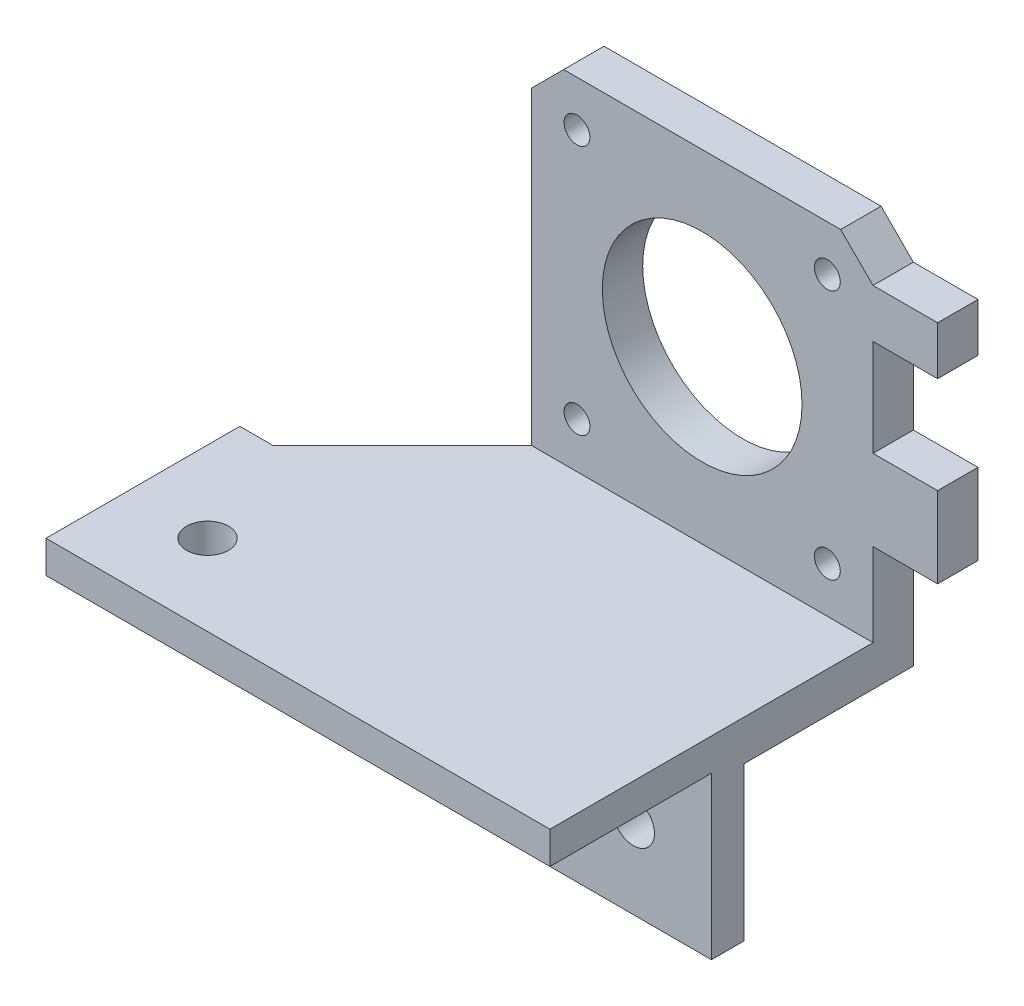
ISO-10303-21;
HEADER;
FILE_DESCRIPTION(('STEP AP214'),'2;1');
FILE_NAME('part.step','',(''),(''),'','','');
FILE_SCHEMA(('AUTOMOTIVE_DESIGN { 1 0 10303 214 1 1 1 1 }'));
ENDSEC;
DATA;
#1=APPLICATION_CONTEXT('core data for automotive mechanical design processes');
#2=APPLICATION_PROTOCOL_DEFINITION('international standard','automotive_design',2000,#1);
#3=PRODUCT_CONTEXT('',#1,'mechanical');
#4=PRODUCT('Part','Part','',(#3));
#5=PRODUCT_RELATED_PRODUCT_CATEGORY('part','',(#4));
#6=PRODUCT_DEFINITION_FORMATION('','',#4);
#7=PRODUCT_DEFINITION_CONTEXT('part definition',#1,'design');
#8=PRODUCT_DEFINITION('design','',#6,#7);
#9=PRODUCT_DEFINITION_SHAPE('','',#8);
#10=(LENGTH_UNIT() NAMED_UNIT(*) SI_UNIT(.MILLI.,.METRE.));
#11=(NAMED_UNIT(*) PLANE_ANGLE_UNIT() SI_UNIT($,.RADIAN.));
#12=(NAMED_UNIT(*) SI_UNIT($,.STERADIAN.) SOLID_ANGLE_UNIT());
#13=UNCERTAINTY_MEASURE_WITH_UNIT(LENGTH_MEASURE(1.E-05),#10,'distance_accuracy_value','');
#14=(GEOMETRIC_REPRESENTATION_CONTEXT(3) GLOBAL_UNCERTAINTY_ASSIGNED_CONTEXT((#13)) GLOBAL_UNIT_ASSIGNED_CONTEXT((#10,
#11,#12)) REPRESENTATION_CONTEXT('',''));
#15=CARTESIAN_POINT('',(0.,0.,0.));
#16=DIRECTION('',(0.,0.,1.));
#17=DIRECTION('',(1.,0.,0.));
#18=AXIS2_PLACEMENT_3D('',#15,#16,#17);
#19=CARTESIAN_POINT('',(-40.,-12.9710597708542,-44.));
#20=DIRECTION('',(-1.,0.,0.));
#21=DIRECTION('',(0.,0.,-1.));
#22=AXIS2_PLACEMENT_3D('',#19,#20,#21);
#23=PLANE('',#22);
#24=DIRECTION('',(0.,0.,1.));
#25=VECTOR('',#24,1.);
#26=CARTESIAN_POINT('',(-40.,31.3289402291458,-65.));
#27=LINE('',#26,#25);
#28=CARTESIAN_POINT('',(-40.,31.3289402291458,-65.));
#29=VERTEX_POINT('',#28);
#30=CARTESIAN_POINT('',(-40.,31.3289402291458,-60.));
#31=VERTEX_POINT('',#30);
#32=EDGE_CURVE('E424',#29,#31,#27,.T.);
#33=ORIENTED_EDGE('',*,*,#32,.F.);
#34=DIRECTION('',(0.,1.,0.));
#35=VECTOR('',#34,1.);
#36=CARTESIAN_POINT('',(-40.,6.02894022914576,-65.));
#37=LINE('',#36,#35);
#38=CARTESIAN_POINT('',(-40.,43.3289402291458,-65.));
#39=VERTEX_POINT('',#38);
#40=EDGE_CURVE('E198',#29,#39,#37,.T.);
#41=ORIENTED_EDGE('',*,*,#40,.T.);
#42=DIRECTION('',(0.,0.,-1.));
#43=VECTOR('',#42,1.);
#44=CARTESIAN_POINT('',(-40.,43.3289402291458,-65.));
#45=LINE('',#44,#43);
#46=CARTESIAN_POINT('',(-40.0000000000001,43.3289402291458,-60.));
#47=VERTEX_POINT('',#46);
#48=EDGE_CURVE('E199',#47,#39,#45,.T.);
#49=ORIENTED_EDGE('',*,*,#48,.F.);
#50=DIRECTION('',(0.,1.,0.));
#51=VECTOR('',#50,1.);
#52=CARTESIAN_POINT('',(-40.,6.02894022914576,-60.));
#53=LINE('',#52,#51);
#54=EDGE_CURVE('E47',#31,#47,#53,.T.);
#55=ORIENTED_EDGE('',*,*,#54,.F.);
#56=EDGE_LOOP('',(#33,#41,#49,#55));
#57=FACE_BOUND('',#56,.T.);
#58=ADVANCED_FACE('F32',(#57),#23,.F.);
#59=DIRECTION('',(0.,0.,-1.));
#60=VECTOR('',#59,1.);
#61=CARTESIAN_POINT('',(-40.,21.3289402291457,-65.));
#62=LINE('',#61,#60);
#63=CARTESIAN_POINT('',(-40.,21.3289402291457,-60.));
#64=VERTEX_POINT('',#63);
#65=CARTESIAN_POINT('',(-40.,21.3289402291457,-65.));
#66=VERTEX_POINT('',#65);
#67=EDGE_CURVE('E55',#64,#66,#62,.T.);
#68=ORIENTED_EDGE('',*,*,#67,.F.);
#69=CARTESIAN_POINT('',(-40.,11.0289402291458,-60.));
#70=VERTEX_POINT('',#69);
#71=EDGE_CURVE('E315',#70,#64,#53,.T.);
#72=ORIENTED_EDGE('',*,*,#71,.F.);
#73=DIRECTION('',(0.,0.,1.));
#74=VECTOR('',#73,1.);
#75=CARTESIAN_POINT('',(-40.,11.0289402291458,-44.));
#76=LINE('',#75,#74);
#77=CARTESIAN_POINT('',(-40.,11.0289402291458,-20.));
#78=VERTEX_POINT('',#77);
#79=EDGE_CURVE('E375',#70,#78,#76,.T.);
#80=ORIENTED_EDGE('',*,*,#79,.T.);
#81=DIRECTION('',(0.,1.,0.));
#82=VECTOR('',#81,1.);
#83=CARTESIAN_POINT('',(-40.,11.0289402291458,-20.));
#84=LINE('',#83,#82);
#85=CARTESIAN_POINT('',(-40.,7.02894022914576,-20.));
#86=VERTEX_POINT('',#85);
#87=EDGE_CURVE('E240',#86,#78,#84,.T.);
#88=ORIENTED_EDGE('',*,*,#87,.F.);
#89=DIRECTION('',(0.,0.,-1.));
#90=VECTOR('',#89,1.);
#91=CARTESIAN_POINT('',(-40.,7.02894022914579,42.5196876527665));
#92=LINE('',#91,#90);
#93=CARTESIAN_POINT('',(-40.,7.02894022914575,-40.));
#94=VERTEX_POINT('',#93);
#95=EDGE_CURVE('E248',#86,#94,#92,.T.);
#96=ORIENTED_EDGE('',*,*,#95,.T.);
#97=DIRECTION('',(0.,1.,0.));
#98=VECTOR('',#97,1.);
#99=CARTESIAN_POINT('',(-40.,-12.9710597708542,-40.));
#100=LINE('',#99,#98);
#101=CARTESIAN_POINT('',(-40.,-12.9710597708542,-40.));
#102=VERTEX_POINT('',#101);
#103=EDGE_CURVE('E344',#102,#94,#100,.T.);
#104=ORIENTED_EDGE('',*,*,#103,.F.);
#105=DIRECTION('',(0.,0.,1.));
#106=VECTOR('',#105,1.);
#107=CARTESIAN_POINT('',(-40.,-12.9710597708542,-44.));
#108=LINE('',#107,#106);
#109=CARTESIAN_POINT('',(-40.,-12.9710597708542,-44.));
#110=VERTEX_POINT('',#109);
#111=EDGE_CURVE('E361',#110,#102,#108,.T.);
#112=ORIENTED_EDGE('',*,*,#111,.F.);
#113=DIRECTION('',(0.,1.,0.));
#114=VECTOR('',#113,1.);
#115=CARTESIAN_POINT('',(-40.,-12.9710597708542,-44.));
#116=LINE('',#115,#114);
#117=CARTESIAN_POINT('',(-40.,6.02894022914576,-44.));
#118=VERTEX_POINT('',#117);
#119=EDGE_CURVE('E349',#110,#118,#116,.T.);
#120=ORIENTED_EDGE('',*,*,#119,.T.);
#121=DIRECTION('',(0.,0.,1.));
#122=VECTOR('',#121,1.);
#123=CARTESIAN_POINT('',(-40.,6.02894022914575,-102.594483210857));
#124=LINE('',#123,#122);
#125=CARTESIAN_POINT('',(-40.,6.02894022914576,-65.));
#126=VERTEX_POINT('',#125);
#127=EDGE_CURVE('E337',#126,#118,#124,.T.);
#128=ORIENTED_EDGE('',*,*,#127,.F.);
#129=EDGE_CURVE('E299',#126,#66,#37,.T.);
#130=ORIENTED_EDGE('',*,*,#129,.T.);
#131=EDGE_LOOP('',(#68,#72,#80,#88,#96,#104,#112,#120,#128,#130));
#132=FACE_BOUND('',#131,.T.);
#133=ADVANCED_FACE('F395',(#132),#23,.F.);
#134=CARTESIAN_POINT('',(0.,0.,-40.));
#135=DIRECTION('',(0.,0.,-1.));
#136=DIRECTION('',(1.,0.,0.));
#137=AXIS2_PLACEMENT_3D('',#134,#135,#136);
#138=PLANE('',#137);
#139=CARTESIAN_POINT('',(-49.6556066891385,-2.97105977085422,-40.));
#140=DIRECTION('',(0.,0.,1.));
#141=DIRECTION('',(1.,0.,0.));
#142=AXIS2_PLACEMENT_3D('',#139,#140,#141);
#143=CIRCLE('',#142,2.6);
#144=CARTESIAN_POINT('',(-47.0556066891385,-2.97105977085422,-40.));
#145=VERTEX_POINT('',#144);
#146=EDGE_CURVE('E265',#145,#145,#143,.T.);
#147=ORIENTED_EDGE('',*,*,#146,.F.);
#148=EDGE_LOOP('',(#147));
#149=FACE_BOUND('',#148,.T.);
#150=CARTESIAN_POINT('',(-69.6556066891385,-2.97105977085422,-40.));
#151=DIRECTION('',(0.,0.,1.));
#152=DIRECTION('',(1.,0.,0.));
#153=AXIS2_PLACEMENT_3D('',#150,#151,#152);
#154=CIRCLE('',#153,2.6);
#155=CARTESIAN_POINT('',(-67.0556066891385,-2.97105977085422,-40.));
#156=VERTEX_POINT('',#155);
#157=EDGE_CURVE('E259',#156,#156,#154,.T.);
#158=ORIENTED_EDGE('',*,*,#157,.F.);
#159=EDGE_LOOP('',(#158));
#160=FACE_BOUND('',#159,.T.);
#161=CARTESIAN_POINT('',(-89.6556066891385,-2.97105977085422,-40.));
#162=DIRECTION('',(0.,0.,1.));
#163=DIRECTION('',(1.,0.,0.));
#164=AXIS2_PLACEMENT_3D('',#161,#162,#163);
#165=CIRCLE('',#164,2.6);
#166=CARTESIAN_POINT('',(-87.0556066891385,-2.97105977085422,-40.));
#167=VERTEX_POINT('',#166);
#168=EDGE_CURVE('E252',#167,#167,#165,.T.);
#169=ORIENTED_EDGE('',*,*,#168,.F.);
#170=EDGE_LOOP('',(#169));
#171=FACE_BOUND('',#170,.T.);
#172=DIRECTION('',(-1.,0.,0.));
#173=VECTOR('',#172,1.);
#174=CARTESIAN_POINT('',(-40.,7.02894022914576,-40.));
#175=LINE('',#174,#173);
#176=CARTESIAN_POINT('',(-102.391596743468,7.02894022914576,-40.));
#177=VERTEX_POINT('',#176);
#178=EDGE_CURVE('E231',#94,#177,#175,.T.);
#179=ORIENTED_EDGE('',*,*,#178,.T.);
#180=DIRECTION('',(0.,-1.,0.));
#181=VECTOR('',#180,1.);
#182=CARTESIAN_POINT('',(-102.391596743468,-12.9710597708542,-40.));
#183=LINE('',#182,#181);
#184=CARTESIAN_POINT('',(-102.391596743468,-12.9710597708542,-40.));
#185=VERTEX_POINT('',#184);
#186=EDGE_CURVE('E364',#177,#185,#183,.T.);
#187=ORIENTED_EDGE('',*,*,#186,.T.);
#188=DIRECTION('',(1.,0.,0.));
#189=VECTOR('',#188,1.);
#190=CARTESIAN_POINT('',(-40.,-12.9710597708542,-40.));
#191=LINE('',#190,#189);
#192=EDGE_CURVE('E353',#185,#102,#191,.T.);
#193=ORIENTED_EDGE('',*,*,#192,.T.);
#194=ORIENTED_EDGE('',*,*,#103,.T.);
#195=EDGE_LOOP('',(#179,#187,#193,#194));
#196=FACE_BOUND('',#195,.T.);
#197=ADVANCED_FACE('F467',(#149,#160,#171,#196),#138,.F.);
#198=CARTESIAN_POINT('',(-40.,11.0289402291458,-44.));
#199=DIRECTION('',(0.,-1.,0.));
#200=DIRECTION('',(0.,0.,1.));
#201=AXIS2_PLACEMENT_3D('',#198,#199,#200);
#202=PLANE('',#201);
#203=CARTESIAN_POINT('',(-92.3915967434677,11.0289402291458,-30.));
#204=DIRECTION('',(0.,-1.,0.));
#205=DIRECTION('',(0.,0.,-1.));
#206=AXIS2_PLACEMENT_3D('',#203,#204,#205);
#207=CIRCLE('',#206,2.6);
#208=CARTESIAN_POINT('',(-92.3915967434677,11.0289402291458,-32.6));
#209=VERTEX_POINT('',#208);
#210=EDGE_CURVE('E227',#209,#209,#207,.T.);
#211=ORIENTED_EDGE('',*,*,#210,.T.);
#212=EDGE_LOOP('',(#211));
#213=FACE_BOUND('',#212,.T.);
#214=ORIENTED_EDGE('',*,*,#79,.F.);
#215=DIRECTION('',(-1.,0.,0.));
#216=VECTOR('',#215,1.);
#217=CARTESIAN_POINT('',(-40.,11.0289402291458,-60.));
#218=LINE('',#217,#216);
#219=CARTESIAN_POINT('',(-82.3,11.0289402291458,-60.));
#220=VERTEX_POINT('',#219);
#221=EDGE_CURVE('E340',#70,#220,#218,.T.);
#222=ORIENTED_EDGE('',*,*,#221,.T.);
#223=DIRECTION('',(0.707106781186544,0.,-0.707106781186551));
#224=VECTOR('',#223,1.);
#225=CARTESIAN_POINT('',(-69.1500000000003,11.0289402291458,-73.15));
#226=LINE('',#225,#224);
#227=CARTESIAN_POINT('',(-98.3,11.0289402291458,-44.));
#228=VERTEX_POINT('',#227);
#229=EDGE_CURVE('E11',#228,#220,#226,.T.);
#230=ORIENTED_EDGE('',*,*,#229,.F.);
#231=DIRECTION('',(-1.,0.,0.));
#232=VECTOR('',#231,1.);
#233=CARTESIAN_POINT('',(-40.,11.0289402291458,-44.));
#234=LINE('',#233,#232);
#235=CARTESIAN_POINT('',(-102.391596743468,11.0289402291458,-44.));
#236=VERTEX_POINT('',#235);
#237=EDGE_CURVE('E352',#228,#236,#234,.T.);
#238=ORIENTED_EDGE('',*,*,#237,.T.);
#239=DIRECTION('',(0.,0.,1.));
#240=VECTOR('',#239,1.);
#241=CARTESIAN_POINT('',(-102.391596743468,11.0289402291458,-44.));
#242=LINE('',#241,#240);
#243=CARTESIAN_POINT('',(-102.391596743468,11.0289402291458,-20.));
#244=VERTEX_POINT('',#243);
#245=EDGE_CURVE('E372',#236,#244,#242,.T.);
#246=ORIENTED_EDGE('',*,*,#245,.T.);
#247=DIRECTION('',(-1.,0.,0.));
#248=VECTOR('',#247,1.);
#249=CARTESIAN_POINT('',(-40.,11.0289402291458,-20.));
#250=LINE('',#249,#248);
#251=EDGE_CURVE('E238',#78,#244,#250,.T.);
#252=ORIENTED_EDGE('',*,*,#251,.F.);
#253=EDGE_LOOP('',(#214,#222,#230,#238,#246,#252));
#254=FACE_BOUND('',#253,.T.);
#255=ADVANCED_FACE('F408',(#213,#254),#202,.F.);
#256=CARTESIAN_POINT('',(-102.391596743468,-12.9710597708542,-44.));
#257=DIRECTION('',(1.,0.,0.));
#258=DIRECTION('',(0.,0.,1.));
#259=AXIS2_PLACEMENT_3D('',#256,#257,#258);
#260=PLANE('',#259);
#261=ORIENTED_EDGE('',*,*,#245,.F.);
#262=DIRECTION('',(0.,-1.,0.));
#263=VECTOR('',#262,1.);
#264=CARTESIAN_POINT('',(-102.391596743468,-12.9710597708542,-44.));
#265=LINE('',#264,#263);
#266=CARTESIAN_POINT('',(-102.391596743468,-12.9710597708542,-44.));
#267=VERTEX_POINT('',#266);
#268=EDGE_CURVE('E356',#236,#267,#265,.T.);
#269=ORIENTED_EDGE('',*,*,#268,.T.);
#270=DIRECTION('',(0.,0.,1.));
#271=VECTOR('',#270,1.);
#272=CARTESIAN_POINT('',(-102.391596743468,-12.9710597708542,-44.));
#273=LINE('',#272,#271);
#274=EDGE_CURVE('E370',#267,#185,#273,.T.);
#275=ORIENTED_EDGE('',*,*,#274,.T.);
#276=ORIENTED_EDGE('',*,*,#186,.F.);
#277=DIRECTION('',(0.,0.,-1.));
#278=VECTOR('',#277,1.);
#279=CARTESIAN_POINT('',(-102.391596743468,7.02894022914579,42.5196876527665));
#280=LINE('',#279,#278);
#281=CARTESIAN_POINT('',(-102.391596743468,7.02894022914576,-20.));
#282=VERTEX_POINT('',#281);
#283=EDGE_CURVE('E246',#282,#177,#280,.T.);
#284=ORIENTED_EDGE('',*,*,#283,.F.);
#285=DIRECTION('',(0.,-1.,0.));
#286=VECTOR('',#285,1.);
#287=CARTESIAN_POINT('',(-102.391596743468,11.0289402291458,-20.));
#288=LINE('',#287,#286);
#289=EDGE_CURVE('E234',#244,#282,#288,.T.);
#290=ORIENTED_EDGE('',*,*,#289,.F.);
#291=EDGE_LOOP('',(#261,#269,#275,#276,#284,#290));
#292=FACE_BOUND('',#291,.T.);
#293=ADVANCED_FACE('F404',(#292),#260,.F.);
#294=CARTESIAN_POINT('',(-40.,-12.9710597708542,-44.));
#295=DIRECTION('',(0.,1.,0.));
#296=DIRECTION('',(0.,0.,-1.));
#297=AXIS2_PLACEMENT_3D('',#294,#295,#296);
#298=PLANE('',#297);
#299=ORIENTED_EDGE('',*,*,#192,.F.);
#300=ORIENTED_EDGE('',*,*,#274,.F.);
#301=DIRECTION('',(1.,0.,0.));
#302=VECTOR('',#301,1.);
#303=CARTESIAN_POINT('',(-40.,-12.9710597708542,-44.));
#304=LINE('',#303,#302);
#305=EDGE_CURVE('E359',#267,#110,#304,.T.);
#306=ORIENTED_EDGE('',*,*,#305,.T.);
#307=ORIENTED_EDGE('',*,*,#111,.T.);
#308=EDGE_LOOP('',(#299,#300,#306,#307));
#309=FACE_BOUND('',#308,.T.);
#310=ADVANCED_FACE('F401',(#309),#298,.F.);
#311=CARTESIAN_POINT('',(0.,0.,-44.));
#312=DIRECTION('',(0.,0.,-1.));
#313=DIRECTION('',(1.,0.,0.));
#314=AXIS2_PLACEMENT_3D('',#311,#312,#313);
#315=PLANE('',#314);
#316=CARTESIAN_POINT('',(-89.6556066891385,-2.97105977085422,-44.));
#317=DIRECTION('',(0.,0.,1.));
#318=DIRECTION('',(1.,0.,0.));
#319=AXIS2_PLACEMENT_3D('',#316,#317,#318);
#320=CIRCLE('',#319,2.6);
#321=CARTESIAN_POINT('',(-87.0556066891385,-2.97105977085422,-44.));
#322=VERTEX_POINT('',#321);
#323=EDGE_CURVE('E256',#322,#322,#320,.T.);
#324=ORIENTED_EDGE('',*,*,#323,.T.);
#325=EDGE_LOOP('',(#324));
#326=FACE_BOUND('',#325,.T.);
#327=CARTESIAN_POINT('',(-69.6556066891385,-2.97105977085422,-44.));
#328=DIRECTION('',(0.,0.,1.));
#329=DIRECTION('',(1.,0.,0.));
#330=AXIS2_PLACEMENT_3D('',#327,#328,#329);
#331=CIRCLE('',#330,2.6);
#332=CARTESIAN_POINT('',(-67.0556066891385,-2.97105977085422,-44.));
#333=VERTEX_POINT('',#332);
#334=EDGE_CURVE('E262',#333,#333,#331,.T.);
#335=ORIENTED_EDGE('',*,*,#334,.T.);
#336=EDGE_LOOP('',(#335));
#337=FACE_BOUND('',#336,.T.);
#338=CARTESIAN_POINT('',(-49.6556066891385,-2.97105977085422,-44.));
#339=DIRECTION('',(0.,0.,1.));
#340=DIRECTION('',(1.,0.,0.));
#341=AXIS2_PLACEMENT_3D('',#338,#339,#340);
#342=CIRCLE('',#341,2.6);
#343=CARTESIAN_POINT('',(-47.0556066891385,-2.97105977085422,-44.));
#344=VERTEX_POINT('',#343);
#345=EDGE_CURVE('E243',#344,#344,#342,.T.);
#346=ORIENTED_EDGE('',*,*,#345,.T.);
#347=EDGE_LOOP('',(#346));
#348=FACE_BOUND('',#347,.T.);
#349=DIRECTION('',(1.,0.,0.));
#350=VECTOR('',#349,1.);
#351=CARTESIAN_POINT('',(-40.,6.02894022914577,-44.));
#352=LINE('',#351,#350);
#353=CARTESIAN_POINT('',(-98.3,6.02894022914576,-44.));
#354=VERTEX_POINT('',#353);
#355=EDGE_CURVE('E338',#354,#118,#352,.T.);
#356=ORIENTED_EDGE('',*,*,#355,.T.);
#357=ORIENTED_EDGE('',*,*,#119,.F.);
#358=ORIENTED_EDGE('',*,*,#305,.F.);
#359=ORIENTED_EDGE('',*,*,#268,.F.);
#360=ORIENTED_EDGE('',*,*,#237,.F.);
#361=DIRECTION('',(0.,1.,0.));
#362=VECTOR('',#361,1.);
#363=CARTESIAN_POINT('',(-98.3,0.,-44.));
#364=LINE('',#363,#362);
#365=EDGE_CURVE('E381',#354,#228,#364,.T.);
#366=ORIENTED_EDGE('',*,*,#365,.F.);
#367=EDGE_LOOP('',(#356,#357,#358,#359,#360,#366));
#368=FACE_BOUND('',#367,.T.);
#369=ADVANCED_FACE('F389',(#326,#337,#348,#368),#315,.T.);
#370=CARTESIAN_POINT('',(-82.3,11.0289402291457,-102.594483210857));
#371=DIRECTION('',(1.,0.,0.));
#372=DIRECTION('',(0.,0.,1.));
#373=AXIS2_PLACEMENT_3D('',#370,#371,#372);
#374=PLANE('',#373);
#375=DIRECTION('',(0.,-1.,0.));
#376=VECTOR('',#375,1.);
#377=CARTESIAN_POINT('',(-82.3,6.02894022914576,-60.));
#378=LINE('',#377,#376);
#379=CARTESIAN_POINT('',(-82.3,49.3289402291458,-60.));
#380=VERTEX_POINT('',#379);
#381=EDGE_CURVE('E325',#380,#220,#378,.T.);
#382=ORIENTED_EDGE('',*,*,#381,.F.);
#383=DIRECTION('',(0.,0.,1.));
#384=VECTOR('',#383,1.);
#385=CARTESIAN_POINT('',(-82.3,49.3289402291458,-65.));
#386=LINE('',#385,#384);
#387=CARTESIAN_POINT('',(-82.3,49.3289402291458,-65.));
#388=VERTEX_POINT('',#387);
#389=EDGE_CURVE('E314',#388,#380,#386,.T.);
#390=ORIENTED_EDGE('',*,*,#389,.F.);
#391=DIRECTION('',(0.,-1.,0.));
#392=VECTOR('',#391,1.);
#393=CARTESIAN_POINT('',(-82.3,6.02894022914575,-65.));
#394=LINE('',#393,#392);
#395=CARTESIAN_POINT('',(-82.3,6.02894022914575,-65.));
#396=VERTEX_POINT('',#395);
#397=EDGE_CURVE('E309',#388,#396,#394,.T.);
#398=ORIENTED_EDGE('',*,*,#397,.T.);
#399=DIRECTION('',(0.,0.,1.));
#400=VECTOR('',#399,1.);
#401=CARTESIAN_POINT('',(-82.3,6.02894022914574,-102.594483210857));
#402=LINE('',#401,#400);
#403=CARTESIAN_POINT('',(-82.3,6.02894022914576,-60.0000000000001));
#404=VERTEX_POINT('',#403);
#405=EDGE_CURVE('E341',#396,#404,#402,.T.);
#406=ORIENTED_EDGE('',*,*,#405,.T.);
#407=DIRECTION('',(0.,-1.,0.));
#408=VECTOR('',#407,1.);
#409=CARTESIAN_POINT('',(-82.3,11.0289402291458,-60.0000000000001));
#410=LINE('',#409,#408);
#411=EDGE_CURVE('E378',#220,#404,#410,.T.);
#412=ORIENTED_EDGE('',*,*,#411,.F.);
#413=EDGE_LOOP('',(#382,#390,#398,#406,#412));
#414=FACE_BOUND('',#413,.T.);
#415=ADVANCED_FACE('F417',(#414),#374,.F.);
#416=CARTESIAN_POINT('',(-40.,6.02894022914575,-102.594483210857));
#417=DIRECTION('',(0.,1.,0.));
#418=DIRECTION('',(-1.,0.,0.));
#419=AXIS2_PLACEMENT_3D('',#416,#417,#418);
#420=PLANE('',#419);
#421=ORIENTED_EDGE('',*,*,#127,.T.);
#422=ORIENTED_EDGE('',*,*,#355,.F.);
#423=DIRECTION('',(-0.707106781186544,0.,0.707106781186551));
#424=VECTOR('',#423,1.);
#425=CARTESIAN_POINT('',(-39.8527583945717,6.02894022914575,-102.447241605429));
#426=LINE('',#425,#424);
#427=EDGE_CURVE('E40',#404,#354,#426,.T.);
#428=ORIENTED_EDGE('',*,*,#427,.F.);
#429=ORIENTED_EDGE('',*,*,#405,.F.);
#430=DIRECTION('',(1.,0.,0.));
#431=VECTOR('',#430,1.);
#432=CARTESIAN_POINT('',(-40.,6.02894022914576,-65.));
#433=LINE('',#432,#431);
#434=EDGE_CURVE('E312',#396,#126,#433,.T.);
#435=ORIENTED_EDGE('',*,*,#434,.T.);
#436=EDGE_LOOP('',(#421,#422,#428,#429,#435));
#437=FACE_BOUND('',#436,.T.);
#438=ADVANCED_FACE('F392',(#437),#420,.F.);
#439=CARTESIAN_POINT('',(0.,0.,-60.));
#440=DIRECTION('',(0.,0.,-1.));
#441=DIRECTION('',(1.,0.,0.));
#442=AXIS2_PLACEMENT_3D('',#439,#440,#441);
#443=PLANE('',#442);
#444=CARTESIAN_POINT('',(-45.65,47.6789402291458,-60.));
#445=DIRECTION('',(0.,0.,1.));
#446=DIRECTION('',(1.,0.,0.));
#447=AXIS2_PLACEMENT_3D('',#444,#445,#446);
#448=CIRCLE('',#447,1.6);
#449=CARTESIAN_POINT('',(-44.05,47.6789402291458,-60.));
#450=VERTEX_POINT('',#449);
#451=EDGE_CURVE('E291',#450,#450,#448,.T.);
#452=ORIENTED_EDGE('',*,*,#451,.F.);
#453=EDGE_LOOP('',(#452));
#454=FACE_BOUND('',#453,.T.);
#455=CARTESIAN_POINT('',(-61.15,32.1789402291458,-60.));
#456=DIRECTION('',(0.,0.,1.));
#457=DIRECTION('',(1.,0.,0.));
#458=AXIS2_PLACEMENT_3D('',#455,#456,#457);
#459=CIRCLE('',#458,12.3643409800213);
#460=CARTESIAN_POINT('',(-48.7856590199787,32.1789402291458,-60.));
#461=VERTEX_POINT('',#460);
#462=EDGE_CURVE('E285',#461,#461,#459,.T.);
#463=ORIENTED_EDGE('',*,*,#462,.F.);
#464=EDGE_LOOP('',(#463));
#465=FACE_BOUND('',#464,.T.);
#466=CARTESIAN_POINT('',(-76.65,47.6789402291455,-60.));
#467=DIRECTION('',(0.,0.,1.));
#468=DIRECTION('',(1.,0.,0.));
#469=AXIS2_PLACEMENT_3D('',#466,#467,#468);
#470=CIRCLE('',#469,1.6);
#471=CARTESIAN_POINT('',(-75.05,47.6789402291455,-60.));
#472=VERTEX_POINT('',#471);
#473=EDGE_CURVE('E279',#472,#472,#470,.T.);
#474=ORIENTED_EDGE('',*,*,#473,.F.);
#475=EDGE_LOOP('',(#474));
#476=FACE_BOUND('',#475,.T.);
#477=CARTESIAN_POINT('',(-76.6499999999997,16.6789402291455,-60.));
#478=DIRECTION('',(0.,0.,1.));
#479=DIRECTION('',(1.,0.,0.));
#480=AXIS2_PLACEMENT_3D('',#477,#478,#479);
#481=CIRCLE('',#480,1.6);
#482=CARTESIAN_POINT('',(-75.0499999999997,16.6789402291455,-60.));
#483=VERTEX_POINT('',#482);
#484=EDGE_CURVE('E273',#483,#483,#481,.T.);
#485=ORIENTED_EDGE('',*,*,#484,.F.);
#486=EDGE_LOOP('',(#485));
#487=FACE_BOUND('',#486,.T.);
#488=CARTESIAN_POINT('',(-45.6499999999997,16.6789402291458,-60.));
#489=DIRECTION('',(0.,0.,1.));
#490=DIRECTION('',(1.,0.,0.));
#491=AXIS2_PLACEMENT_3D('',#488,#489,#490);
#492=CIRCLE('',#491,1.6);
#493=CARTESIAN_POINT('',(-44.0499999999997,16.6789402291458,-60.));
#494=VERTEX_POINT('',#493);
#495=EDGE_CURVE('E255',#494,#494,#492,.T.);
#496=ORIENTED_EDGE('',*,*,#495,.F.);
#497=EDGE_LOOP('',(#496));
#498=FACE_BOUND('',#497,.T.);
#499=ORIENTED_EDGE('',*,*,#71,.T.);
#500=DIRECTION('',(-1.,0.,0.));
#501=VECTOR('',#500,1.);
#502=CARTESIAN_POINT('',(-32.,21.3289402291457,-60.));
#503=LINE('',#502,#501);
#504=CARTESIAN_POINT('',(-32.,21.3289402291457,-60.));
#505=VERTEX_POINT('',#504);
#506=EDGE_CURVE('E204',#505,#64,#503,.T.);
#507=ORIENTED_EDGE('',*,*,#506,.F.);
#508=DIRECTION('',(0.,-1.,0.));
#509=VECTOR('',#508,1.);
#510=CARTESIAN_POINT('',(-32.,21.3289402291457,-60.));
#511=LINE('',#510,#509);
#512=CARTESIAN_POINT('',(-32.,31.3289402291458,-60.));
#513=VERTEX_POINT('',#512);
#514=EDGE_CURVE('E183',#513,#505,#511,.T.);
#515=ORIENTED_EDGE('',*,*,#514,.F.);
#516=DIRECTION('',(-1.,0.,0.));
#517=VECTOR('',#516,1.);
#518=CARTESIAN_POINT('',(-32.,31.3289402291458,-60.));
#519=LINE('',#518,#517);
#520=EDGE_CURVE('E180',#513,#31,#519,.T.);
#521=ORIENTED_EDGE('',*,*,#520,.T.);
#522=ORIENTED_EDGE('',*,*,#54,.T.);
#523=DIRECTION('',(-1.,0.,0.));
#524=VECTOR('',#523,1.);
#525=CARTESIAN_POINT('',(-32.,43.3289402291458,-60.));
#526=LINE('',#525,#524);
#527=CARTESIAN_POINT('',(-32.,43.3289402291458,-60.));
#528=VERTEX_POINT('',#527);
#529=EDGE_CURVE('E218',#528,#47,#526,.T.);
#530=ORIENTED_EDGE('',*,*,#529,.F.);
#531=DIRECTION('',(0.,-1.,0.));
#532=VECTOR('',#531,1.);
#533=CARTESIAN_POINT('',(-32.,49.3289402291458,-60.));
#534=LINE('',#533,#532);
#535=CARTESIAN_POINT('',(-32.,49.3289402291458,-60.));
#536=VERTEX_POINT('',#535);
#537=EDGE_CURVE('E212',#536,#528,#534,.T.);
#538=ORIENTED_EDGE('',*,*,#537,.F.);
#539=DIRECTION('',(-1.,0.,0.));
#540=VECTOR('',#539,1.);
#541=CARTESIAN_POINT('',(-32.,49.3289402291458,-60.));
#542=LINE('',#541,#540);
#543=CARTESIAN_POINT('',(-40.0000000000001,49.3289402291458,-60.));
#544=VERTEX_POINT('',#543);
#545=EDGE_CURVE('E221',#536,#544,#542,.T.);
#546=ORIENTED_EDGE('',*,*,#545,.T.);
#547=DIRECTION('',(-0.707106781186548,0.707106781186547,0.));
#548=VECTOR('',#547,1.);
#549=CARTESIAN_POINT('',(-40.0000000000001,49.3289402291458,-60.));
#550=LINE('',#549,#548);
#551=CARTESIAN_POINT('',(-44.,53.3289402291458,-60.));
#552=VERTEX_POINT('',#551);
#553=EDGE_CURVE('E317',#544,#552,#550,.T.);
#554=ORIENTED_EDGE('',*,*,#553,.T.);
#555=DIRECTION('',(-1.,0.,0.));
#556=VECTOR('',#555,1.);
#557=CARTESIAN_POINT('',(-44.,53.3289402291458,-60.));
#558=LINE('',#557,#556);
#559=CARTESIAN_POINT('',(-78.3000000000001,53.3289402291457,-60.));
#560=VERTEX_POINT('',#559);
#561=EDGE_CURVE('E320',#552,#560,#558,.T.);
#562=ORIENTED_EDGE('',*,*,#561,.T.);
#563=DIRECTION('',(-0.707106781186547,-0.707106781186547,0.));
#564=VECTOR('',#563,1.);
#565=CARTESIAN_POINT('',(-78.3000000000001,53.3289402291457,-60.));
#566=LINE('',#565,#564);
#567=EDGE_CURVE('E323',#560,#380,#566,.T.);
#568=ORIENTED_EDGE('',*,*,#567,.T.);
#569=ORIENTED_EDGE('',*,*,#381,.T.);
#570=ORIENTED_EDGE('',*,*,#221,.F.);
#571=EDGE_LOOP('',(#499,#507,#515,#521,#522,#530,#538,#546,#554,#562,#568,#569,#570));
#572=FACE_BOUND('',#571,.T.);
#573=ADVANCED_FACE('F410',(#454,#465,#476,#487,#498,#572),#443,.F.);
#574=CARTESIAN_POINT('',(0.,0.,-65.));
#575=DIRECTION('',(0.,0.,-1.));
#576=DIRECTION('',(1.,0.,0.));
#577=AXIS2_PLACEMENT_3D('',#574,#575,#576);
#578=PLANE('',#577);
#579=CARTESIAN_POINT('',(-76.6499999999997,16.6789402291455,-65.));
#580=DIRECTION('',(0.,0.,1.));
#581=DIRECTION('',(1.,0.,0.));
#582=AXIS2_PLACEMENT_3D('',#579,#580,#581);
#583=CIRCLE('',#582,1.6);
#584=CARTESIAN_POINT('',(-75.0499999999997,16.6789402291455,-65.));
#585=VERTEX_POINT('',#584);
#586=EDGE_CURVE('E276',#585,#585,#583,.T.);
#587=ORIENTED_EDGE('',*,*,#586,.T.);
#588=EDGE_LOOP('',(#587));
#589=FACE_BOUND('',#588,.T.);
#590=CARTESIAN_POINT('',(-61.15,32.1789402291458,-65.));
#591=DIRECTION('',(0.,0.,1.));
#592=DIRECTION('',(1.,0.,0.));
#593=AXIS2_PLACEMENT_3D('',#590,#591,#592);
#594=CIRCLE('',#593,12.3643409800213);
#595=CARTESIAN_POINT('',(-48.7856590199787,32.1789402291458,-65.));
#596=VERTEX_POINT('',#595);
#597=EDGE_CURVE('E288',#596,#596,#594,.T.);
#598=ORIENTED_EDGE('',*,*,#597,.T.);
#599=EDGE_LOOP('',(#598));
#600=FACE_BOUND('',#599,.T.);
#601=ORIENTED_EDGE('',*,*,#129,.F.);
#602=ORIENTED_EDGE('',*,*,#434,.F.);
#603=ORIENTED_EDGE('',*,*,#397,.F.);
#604=DIRECTION('',(-0.707106781186547,-0.707106781186547,0.));
#605=VECTOR('',#604,1.);
#606=CARTESIAN_POINT('',(-78.3000000000001,53.3289402291457,-65.));
#607=LINE('',#606,#605);
#608=CARTESIAN_POINT('',(-78.3000000000001,53.3289402291457,-65.));
#609=VERTEX_POINT('',#608);
#610=EDGE_CURVE('E307',#609,#388,#607,.T.);
#611=ORIENTED_EDGE('',*,*,#610,.F.);
#612=DIRECTION('',(-1.,0.,0.));
#613=VECTOR('',#612,1.);
#614=CARTESIAN_POINT('',(-44.,53.3289402291458,-65.));
#615=LINE('',#614,#613);
#616=CARTESIAN_POINT('',(-44.,53.3289402291458,-65.));
#617=VERTEX_POINT('',#616);
#618=EDGE_CURVE('E304',#617,#609,#615,.T.);
#619=ORIENTED_EDGE('',*,*,#618,.F.);
#620=DIRECTION('',(-0.707106781186548,0.707106781186547,0.));
#621=VECTOR('',#620,1.);
#622=CARTESIAN_POINT('',(-40.0000000000001,49.3289402291458,-65.));
#623=LINE('',#622,#621);
#624=CARTESIAN_POINT('',(-40.0000000000001,49.3289402291458,-65.));
#625=VERTEX_POINT('',#624);
#626=EDGE_CURVE('E301',#625,#617,#623,.T.);
#627=ORIENTED_EDGE('',*,*,#626,.F.);
#628=DIRECTION('',(-1.,0.,0.));
#629=VECTOR('',#628,1.);
#630=CARTESIAN_POINT('',(-32.,49.3289402291458,-65.));
#631=LINE('',#630,#629);
#632=CARTESIAN_POINT('',(-32.,49.3289402291458,-65.));
#633=VERTEX_POINT('',#632);
#634=EDGE_CURVE('E224',#633,#625,#631,.T.);
#635=ORIENTED_EDGE('',*,*,#634,.F.);
#636=DIRECTION('',(0.,1.,0.));
#637=VECTOR('',#636,1.);
#638=CARTESIAN_POINT('',(-32.,49.3289402291458,-65.));
#639=LINE('',#638,#637);
#640=CARTESIAN_POINT('',(-32.,43.3289402291458,-65.));
#641=VERTEX_POINT('',#640);
#642=EDGE_CURVE('E202',#641,#633,#639,.T.);
#643=ORIENTED_EDGE('',*,*,#642,.F.);
#644=DIRECTION('',(-1.,0.,0.));
#645=VECTOR('',#644,1.);
#646=CARTESIAN_POINT('',(-32.,43.3289402291458,-65.));
#647=LINE('',#646,#645);
#648=EDGE_CURVE('E215',#641,#39,#647,.T.);
#649=ORIENTED_EDGE('',*,*,#648,.T.);
#650=ORIENTED_EDGE('',*,*,#40,.F.);
#651=DIRECTION('',(-1.,0.,0.));
#652=VECTOR('',#651,1.);
#653=CARTESIAN_POINT('',(-32.,31.3289402291458,-65.));
#654=LINE('',#653,#652);
#655=CARTESIAN_POINT('',(-32.,31.3289402291458,-65.));
#656=VERTEX_POINT('',#655);
#657=EDGE_CURVE('E178',#656,#29,#654,.T.);
#658=ORIENTED_EDGE('',*,*,#657,.F.);
#659=DIRECTION('',(0.,1.,0.));
#660=VECTOR('',#659,1.);
#661=CARTESIAN_POINT('',(-32.,21.3289402291457,-65.));
#662=LINE('',#661,#660);
#663=CARTESIAN_POINT('',(-32.,21.3289402291457,-65.));
#664=VERTEX_POINT('',#663);
#665=EDGE_CURVE('E184',#664,#656,#662,.T.);
#666=ORIENTED_EDGE('',*,*,#665,.F.);
#667=DIRECTION('',(-1.,0.,0.));
#668=VECTOR('',#667,1.);
#669=CARTESIAN_POINT('',(-32.,21.3289402291457,-65.));
#670=LINE('',#669,#668);
#671=EDGE_CURVE('E421',#664,#66,#670,.T.);
#672=ORIENTED_EDGE('',*,*,#671,.T.);
#673=EDGE_LOOP('',(#601,#602,#603,#611,#619,#627,#635,#643,#649,#650,#658,#666,#672));
#674=FACE_BOUND('',#673,.T.);
#675=CARTESIAN_POINT('',(-45.65,47.6789402291458,-65.));
#676=DIRECTION('',(0.,0.,1.));
#677=DIRECTION('',(1.,0.,0.));
#678=AXIS2_PLACEMENT_3D('',#675,#676,#677);
#679=CIRCLE('',#678,1.6);
#680=CARTESIAN_POINT('',(-44.05,47.6789402291458,-65.));
#681=VERTEX_POINT('',#680);
#682=EDGE_CURVE('E294',#681,#681,#679,.T.);
#683=ORIENTED_EDGE('',*,*,#682,.T.);
#684=EDGE_LOOP('',(#683));
#685=FACE_BOUND('',#684,.T.);
#686=CARTESIAN_POINT('',(-76.65,47.6789402291455,-65.));
#687=DIRECTION('',(0.,0.,1.));
#688=DIRECTION('',(1.,0.,0.));
#689=AXIS2_PLACEMENT_3D('',#686,#687,#688);
#690=CIRCLE('',#689,1.6);
#691=CARTESIAN_POINT('',(-75.05,47.6789402291455,-65.));
#692=VERTEX_POINT('',#691);
#693=EDGE_CURVE('E282',#692,#692,#690,.T.);
#694=ORIENTED_EDGE('',*,*,#693,.T.);
#695=EDGE_LOOP('',(#694));
#696=FACE_BOUND('',#695,.T.);
#697=CARTESIAN_POINT('',(-45.6499999999997,16.6789402291458,-65.));
#698=DIRECTION('',(0.,0.,1.));
#699=DIRECTION('',(1.,0.,0.));
#700=AXIS2_PLACEMENT_3D('',#697,#698,#699);
#701=CIRCLE('',#700,1.6);
#702=CARTESIAN_POINT('',(-44.0499999999997,16.6789402291458,-65.));
#703=VERTEX_POINT('',#702);
#704=EDGE_CURVE('E270',#703,#703,#701,.T.);
#705=ORIENTED_EDGE('',*,*,#704,.T.);
#706=EDGE_LOOP('',(#705));
#707=FACE_BOUND('',#706,.T.);
#708=ADVANCED_FACE('F195',(#589,#600,#674,#685,#696,#707),#578,.T.);
#709=CARTESIAN_POINT('',(-40.0000000000001,49.3289402291458,-65.));
#710=DIRECTION('',(-0.707106781186547,-0.707106781186548,0.));
#711=DIRECTION('',(0.707106781186548,-0.707106781186547,0.));
#712=AXIS2_PLACEMENT_3D('',#709,#710,#711);
#713=PLANE('',#712);
#714=ORIENTED_EDGE('',*,*,#553,.F.);
#715=DIRECTION('',(0.,0.,1.));
#716=VECTOR('',#715,1.);
#717=CARTESIAN_POINT('',(-40.0000000000001,49.3289402291458,-65.));
#718=LINE('',#717,#716);
#719=EDGE_CURVE('E334',#625,#544,#718,.T.);
#720=ORIENTED_EDGE('',*,*,#719,.F.);
#721=ORIENTED_EDGE('',*,*,#626,.T.);
#722=DIRECTION('',(0.,0.,1.));
#723=VECTOR('',#722,1.);
#724=CARTESIAN_POINT('',(-44.,53.3289402291458,-65.));
#725=LINE('',#724,#723);
#726=EDGE_CURVE('E332',#617,#552,#725,.T.);
#727=ORIENTED_EDGE('',*,*,#726,.T.);
#728=EDGE_LOOP('',(#714,#720,#721,#727));
#729=FACE_BOUND('',#728,.T.);
#730=ADVANCED_FACE('F445',(#729),#713,.F.);
#731=CARTESIAN_POINT('',(-44.,53.3289402291458,-65.));
#732=DIRECTION('',(0.,-1.,0.));
#733=DIRECTION('',(1.,0.,0.));
#734=AXIS2_PLACEMENT_3D('',#731,#732,#733);
#735=PLANE('',#734);
#736=ORIENTED_EDGE('',*,*,#561,.F.);
#737=ORIENTED_EDGE('',*,*,#726,.F.);
#738=ORIENTED_EDGE('',*,*,#618,.T.);
#739=DIRECTION('',(0.,0.,1.));
#740=VECTOR('',#739,1.);
#741=CARTESIAN_POINT('',(-78.3000000000001,53.3289402291457,-65.));
#742=LINE('',#741,#740);
#743=EDGE_CURVE('E330',#609,#560,#742,.T.);
#744=ORIENTED_EDGE('',*,*,#743,.T.);
#745=EDGE_LOOP('',(#736,#737,#738,#744));
#746=FACE_BOUND('',#745,.T.);
#747=ADVANCED_FACE('F448',(#746),#735,.F.);
#748=CARTESIAN_POINT('',(-78.3000000000001,53.3289402291457,-65.));
#749=DIRECTION('',(0.707106781186548,-0.707106781186548,0.));
#750=DIRECTION('',(0.707106781186548,0.707106781186548,0.));
#751=AXIS2_PLACEMENT_3D('',#748,#749,#750);
#752=PLANE('',#751);
#753=ORIENTED_EDGE('',*,*,#567,.F.);
#754=ORIENTED_EDGE('',*,*,#743,.F.);
#755=ORIENTED_EDGE('',*,*,#610,.T.);
#756=ORIENTED_EDGE('',*,*,#389,.T.);
#757=EDGE_LOOP('',(#753,#754,#755,#756));
#758=FACE_BOUND('',#757,.T.);
#759=ADVANCED_FACE('F450',(#758),#752,.F.);
#760=CARTESIAN_POINT('',(-45.65,47.6789402291458,-65.));
#761=DIRECTION('',(0.,0.,1.));
#762=DIRECTION('',(-1.,0.,0.));
#763=AXIS2_PLACEMENT_3D('',#760,#761,#762);
#764=CYLINDRICAL_SURFACE('',#763,1.6);
#765=ORIENTED_EDGE('',*,*,#682,.F.);
#766=EDGE_LOOP('',(#765));
#767=FACE_BOUND('',#766,.T.);
#768=ORIENTED_EDGE('',*,*,#451,.T.);
#769=EDGE_LOOP('',(#768));
#770=FACE_BOUND('',#769,.T.);
#771=ADVANCED_FACE('F452',(#767,#770),#764,.F.);
#772=CARTESIAN_POINT('',(-61.15,32.1789402291458,-65.));
#773=DIRECTION('',(0.,0.,1.));
#774=DIRECTION('',(-1.,0.,0.));
#775=AXIS2_PLACEMENT_3D('',#772,#773,#774);
#776=CYLINDRICAL_SURFACE('',#775,12.3643409800213);
#777=ORIENTED_EDGE('',*,*,#597,.F.);
#778=EDGE_LOOP('',(#777));
#779=FACE_BOUND('',#778,.T.);
#780=ORIENTED_EDGE('',*,*,#462,.T.);
#781=EDGE_LOOP('',(#780));
#782=FACE_BOUND('',#781,.T.);
#783=ADVANCED_FACE('F458',(#779,#782),#776,.F.);
#784=CARTESIAN_POINT('',(-76.65,47.6789402291455,-65.));
#785=DIRECTION('',(0.,0.,1.));
#786=DIRECTION('',(-1.,0.,0.));
#787=AXIS2_PLACEMENT_3D('',#784,#785,#786);
#788=CYLINDRICAL_SURFACE('',#787,1.6);
#789=ORIENTED_EDGE('',*,*,#693,.F.);
#790=EDGE_LOOP('',(#789));
#791=FACE_BOUND('',#790,.T.);
#792=ORIENTED_EDGE('',*,*,#473,.T.);
#793=EDGE_LOOP('',(#792));
#794=FACE_BOUND('',#793,.T.);
#795=ADVANCED_FACE('F500',(#791,#794),#788,.F.);
#796=CARTESIAN_POINT('',(-76.6499999999997,16.6789402291455,-65.));
#797=DIRECTION('',(0.,0.,1.));
#798=DIRECTION('',(-1.,0.,0.));
#799=AXIS2_PLACEMENT_3D('',#796,#797,#798);
#800=CYLINDRICAL_SURFACE('',#799,1.6);
#801=ORIENTED_EDGE('',*,*,#586,.F.);
#802=EDGE_LOOP('',(#801));
#803=FACE_BOUND('',#802,.T.);
#804=ORIENTED_EDGE('',*,*,#484,.T.);
#805=EDGE_LOOP('',(#804));
#806=FACE_BOUND('',#805,.T.);
#807=ADVANCED_FACE('F504',(#803,#806),#800,.F.);
#808=CARTESIAN_POINT('',(-45.6499999999997,16.6789402291458,-65.));
#809=DIRECTION('',(0.,0.,1.));
#810=DIRECTION('',(-1.,0.,0.));
#811=AXIS2_PLACEMENT_3D('',#808,#809,#810);
#812=CYLINDRICAL_SURFACE('',#811,1.6);
#813=ORIENTED_EDGE('',*,*,#704,.F.);
#814=EDGE_LOOP('',(#813));
#815=FACE_BOUND('',#814,.T.);
#816=ORIENTED_EDGE('',*,*,#495,.T.);
#817=EDGE_LOOP('',(#816));
#818=FACE_BOUND('',#817,.T.);
#819=ADVANCED_FACE('F508',(#815,#818),#812,.F.);
#820=CARTESIAN_POINT('',(-82.3,11.0289402291458,-60.0000000000001));
#821=DIRECTION('',(0.707106781186551,0.,0.707106781186544));
#822=DIRECTION('',(0.,-1.,0.));
#823=AXIS2_PLACEMENT_3D('',#820,#821,#822);
#824=PLANE('',#823);
#825=ORIENTED_EDGE('',*,*,#229,.T.);
#826=ORIENTED_EDGE('',*,*,#411,.T.);
#827=ORIENTED_EDGE('',*,*,#427,.T.);
#828=ORIENTED_EDGE('',*,*,#365,.T.);
#829=EDGE_LOOP('',(#825,#826,#827,#828));
#830=FACE_BOUND('',#829,.T.);
#831=ADVANCED_FACE('F34',(#830),#824,.F.);
#832=CARTESIAN_POINT('',(-49.6556066891385,-2.97105977085422,-40.));
#833=DIRECTION('',(0.,0.,-1.));
#834=DIRECTION('',(1.,0.,0.));
#835=AXIS2_PLACEMENT_3D('',#832,#833,#834);
#836=CYLINDRICAL_SURFACE('',#835,2.6);
#837=ORIENTED_EDGE('',*,*,#146,.T.);
#838=EDGE_LOOP('',(#837));
#839=FACE_BOUND('',#838,.T.);
#840=ORIENTED_EDGE('',*,*,#345,.F.);
#841=EDGE_LOOP('',(#840));
#842=FACE_BOUND('',#841,.T.);
#843=ADVANCED_FACE('F513',(#839,#842),#836,.F.);
#844=CARTESIAN_POINT('',(-69.6556066891385,-2.97105977085422,-40.));
#845=DIRECTION('',(0.,0.,-1.));
#846=DIRECTION('',(1.,0.,0.));
#847=AXIS2_PLACEMENT_3D('',#844,#845,#846);
#848=CYLINDRICAL_SURFACE('',#847,2.6);
#849=ORIENTED_EDGE('',*,*,#157,.T.);
#850=EDGE_LOOP('',(#849));
#851=FACE_BOUND('',#850,.T.);
#852=ORIENTED_EDGE('',*,*,#334,.F.);
#853=EDGE_LOOP('',(#852));
#854=FACE_BOUND('',#853,.T.);
#855=ADVANCED_FACE('F516',(#851,#854),#848,.F.);
#856=CARTESIAN_POINT('',(-89.6556066891385,-2.97105977085422,-40.));
#857=DIRECTION('',(0.,0.,-1.));
#858=DIRECTION('',(1.,0.,0.));
#859=AXIS2_PLACEMENT_3D('',#856,#857,#858);
#860=CYLINDRICAL_SURFACE('',#859,2.6);
#861=ORIENTED_EDGE('',*,*,#168,.T.);
#862=EDGE_LOOP('',(#861));
#863=FACE_BOUND('',#862,.T.);
#864=ORIENTED_EDGE('',*,*,#323,.F.);
#865=EDGE_LOOP('',(#864));
#866=FACE_BOUND('',#865,.T.);
#867=ADVANCED_FACE('F520',(#863,#866),#860,.F.);
#868=CARTESIAN_POINT('',(-40.,7.02894022914579,42.5196876527665));
#869=DIRECTION('',(0.,1.,0.));
#870=DIRECTION('',(0.,0.,-1.));
#871=AXIS2_PLACEMENT_3D('',#868,#869,#870);
#872=PLANE('',#871);
#873=CARTESIAN_POINT('',(-92.3915967434677,7.02894022914577,-30.));
#874=DIRECTION('',(0.,-1.,0.));
#875=DIRECTION('',(0.,0.,-1.));
#876=AXIS2_PLACEMENT_3D('',#873,#874,#875);
#877=CIRCLE('',#876,2.6);
#878=CARTESIAN_POINT('',(-92.3915967434677,7.02894022914577,-32.6));
#879=VERTEX_POINT('',#878);
#880=EDGE_CURVE('E228',#879,#879,#877,.T.);
#881=ORIENTED_EDGE('',*,*,#880,.F.);
#882=EDGE_LOOP('',(#881));
#883=FACE_BOUND('',#882,.T.);
#884=ORIENTED_EDGE('',*,*,#283,.T.);
#885=ORIENTED_EDGE('',*,*,#178,.F.);
#886=ORIENTED_EDGE('',*,*,#95,.F.);
#887=DIRECTION('',(1.,0.,0.));
#888=VECTOR('',#887,1.);
#889=CARTESIAN_POINT('',(-40.,7.02894022914576,-20.));
#890=LINE('',#889,#888);
#891=EDGE_CURVE('E237',#282,#86,#890,.T.);
#892=ORIENTED_EDGE('',*,*,#891,.F.);
#893=EDGE_LOOP('',(#884,#885,#886,#892));
#894=FACE_BOUND('',#893,.T.);
#895=ADVANCED_FACE('F524',(#883,#894),#872,.F.);
#896=CARTESIAN_POINT('',(-350.,-6.10905977085424,-20.));
#897=DIRECTION('',(0.,0.,-1.));
#898=DIRECTION('',(1.,0.,0.));
#899=AXIS2_PLACEMENT_3D('',#896,#897,#898);
#900=PLANE('',#899);
#901=ORIENTED_EDGE('',*,*,#891,.T.);
#902=ORIENTED_EDGE('',*,*,#87,.T.);
#903=ORIENTED_EDGE('',*,*,#251,.T.);
#904=ORIENTED_EDGE('',*,*,#289,.T.);
#905=EDGE_LOOP('',(#901,#902,#903,#904));
#906=FACE_BOUND('',#905,.T.);
#907=ADVANCED_FACE('F528',(#906),#900,.F.);
#908=CARTESIAN_POINT('',(-92.3915967434677,7.02894022914577,-30.));
#909=DIRECTION('',(0.,1.,0.));
#910=DIRECTION('',(0.,0.,-1.));
#911=AXIS2_PLACEMENT_3D('',#908,#909,#910);
#912=CYLINDRICAL_SURFACE('',#911,2.6);
#913=ORIENTED_EDGE('',*,*,#880,.T.);
#914=EDGE_LOOP('',(#913));
#915=FACE_BOUND('',#914,.T.);
#916=ORIENTED_EDGE('',*,*,#210,.F.);
#917=EDGE_LOOP('',(#916));
#918=FACE_BOUND('',#917,.T.);
#919=ADVANCED_FACE('F532',(#915,#918),#912,.F.);
#920=CARTESIAN_POINT('',(-32.,49.3289402291458,-65.));
#921=DIRECTION('',(0.,-1.,0.));
#922=DIRECTION('',(1.,0.,0.));
#923=AXIS2_PLACEMENT_3D('',#920,#921,#922);
#924=PLANE('',#923);
#925=ORIENTED_EDGE('',*,*,#719,.T.);
#926=ORIENTED_EDGE('',*,*,#545,.F.);
#927=DIRECTION('',(0.,0.,1.));
#928=VECTOR('',#927,1.);
#929=CARTESIAN_POINT('',(-32.,49.3289402291458,-65.));
#930=LINE('',#929,#928);
#931=EDGE_CURVE('E210',#633,#536,#930,.T.);
#932=ORIENTED_EDGE('',*,*,#931,.F.);
#933=ORIENTED_EDGE('',*,*,#634,.T.);
#934=EDGE_LOOP('',(#925,#926,#932,#933));
#935=FACE_BOUND('',#934,.T.);
#936=ADVANCED_FACE('F442',(#935),#924,.F.);
#937=CARTESIAN_POINT('',(-32.,43.3289402291458,-65.));
#938=DIRECTION('',(0.,1.,0.));
#939=DIRECTION('',(-1.,0.,0.));
#940=AXIS2_PLACEMENT_3D('',#937,#938,#939);
#941=PLANE('',#940);
#942=ORIENTED_EDGE('',*,*,#48,.T.);
#943=ORIENTED_EDGE('',*,*,#648,.F.);
#944=DIRECTION('',(0.,0.,-1.));
#945=VECTOR('',#944,1.);
#946=CARTESIAN_POINT('',(-32.,43.3289402291458,-65.));
#947=LINE('',#946,#945);
#948=EDGE_CURVE('E214',#528,#641,#947,.T.);
#949=ORIENTED_EDGE('',*,*,#948,.F.);
#950=ORIENTED_EDGE('',*,*,#529,.T.);
#951=EDGE_LOOP('',(#942,#943,#949,#950));
#952=FACE_BOUND('',#951,.T.);
#953=ADVANCED_FACE('F435',(#952),#941,.F.);
#954=CARTESIAN_POINT('',(-32.,0.,0.));
#955=DIRECTION('',(-1.,0.,0.));
#956=DIRECTION('',(0.,0.,1.));
#957=AXIS2_PLACEMENT_3D('',#954,#955,#956);
#958=PLANE('',#957);
#959=ORIENTED_EDGE('',*,*,#642,.T.);
#960=ORIENTED_EDGE('',*,*,#931,.T.);
#961=ORIENTED_EDGE('',*,*,#537,.T.);
#962=ORIENTED_EDGE('',*,*,#948,.T.);
#963=EDGE_LOOP('',(#959,#960,#961,#962));
#964=FACE_BOUND('',#963,.T.);
#965=ADVANCED_FACE('F438',(#964),#958,.F.);
#966=CARTESIAN_POINT('',(-32.,31.3289402291458,-65.));
#967=DIRECTION('',(0.,-1.,0.));
#968=DIRECTION('',(1.,0.,0.));
#969=AXIS2_PLACEMENT_3D('',#966,#967,#968);
#970=PLANE('',#969);
#971=ORIENTED_EDGE('',*,*,#32,.T.);
#972=ORIENTED_EDGE('',*,*,#520,.F.);
#973=DIRECTION('',(0.,0.,1.));
#974=VECTOR('',#973,1.);
#975=CARTESIAN_POINT('',(-32.,31.3289402291458,-65.));
#976=LINE('',#975,#974);
#977=EDGE_CURVE('E174',#656,#513,#976,.T.);
#978=ORIENTED_EDGE('',*,*,#977,.F.);
#979=ORIENTED_EDGE('',*,*,#657,.T.);
#980=EDGE_LOOP('',(#971,#972,#978,#979));
#981=FACE_BOUND('',#980,.T.);
#982=ADVANCED_FACE('F176',(#981),#970,.F.);
#983=CARTESIAN_POINT('',(-32.,21.3289402291457,-65.));
#984=DIRECTION('',(0.,1.,0.));
#985=DIRECTION('',(-1.,0.,0.));
#986=AXIS2_PLACEMENT_3D('',#983,#984,#985);
#987=PLANE('',#986);
#988=ORIENTED_EDGE('',*,*,#67,.T.);
#989=ORIENTED_EDGE('',*,*,#671,.F.);
#990=DIRECTION('',(0.,0.,-1.));
#991=VECTOR('',#990,1.);
#992=CARTESIAN_POINT('',(-32.,21.3289402291457,-65.));
#993=LINE('',#992,#991);
#994=EDGE_CURVE('E189',#505,#664,#993,.T.);
#995=ORIENTED_EDGE('',*,*,#994,.F.);
#996=ORIENTED_EDGE('',*,*,#506,.T.);
#997=EDGE_LOOP('',(#988,#989,#995,#996));
#998=FACE_BOUND('',#997,.T.);
#999=ADVANCED_FACE('F423',(#998),#987,.F.);
#1000=CARTESIAN_POINT('',(-32.,0.,0.));
#1001=DIRECTION('',(1.,0.,0.));
#1002=DIRECTION('',(0.,0.,-1.));
#1003=AXIS2_PLACEMENT_3D('',#1000,#1001,#1002);
#1004=PLANE('',#1003);
#1005=ORIENTED_EDGE('',*,*,#665,.T.);
#1006=ORIENTED_EDGE('',*,*,#977,.T.);
#1007=ORIENTED_EDGE('',*,*,#514,.T.);
#1008=ORIENTED_EDGE('',*,*,#994,.T.);
#1009=EDGE_LOOP('',(#1005,#1006,#1007,#1008));
#1010=FACE_BOUND('',#1009,.T.);
#1011=ADVANCED_FACE('F187',(#1010),#1004,.T.);
#1012=CLOSED_SHELL('',(#58,#133,#197,#255,#293,#310,#369,#415,#438,#573,#708,#730,#747,#759,
#771,#783,#795,#807,#819,#831,#843,#855,#867,#895,#907,#919,#936,#953,#965,#982,#999,#1011));
#1013=MANIFOLD_SOLID_BREP('B2',#1012);
#1014=ADVANCED_BREP_SHAPE_REPRESENTATION('',(#18,#1013),#14);
#1015=SHAPE_DEFINITION_REPRESENTATION(#9,#1014);
ENDSEC;
END-ISO-10303-21;
